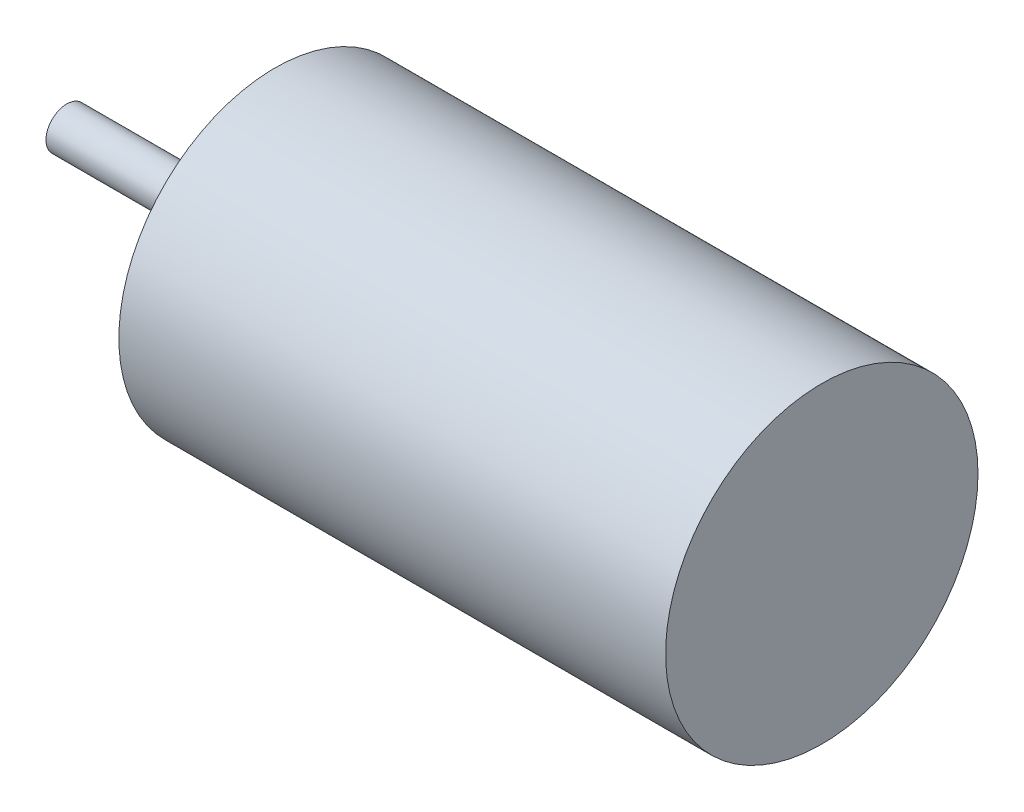
ISO-10303-21;
HEADER;
FILE_DESCRIPTION(('STEP AP214'),'2;1');
FILE_NAME('part.step','',(''),(''),'','','');
FILE_SCHEMA(('AUTOMOTIVE_DESIGN { 1 0 10303 214 1 1 1 1 }'));
ENDSEC;
DATA;
#1=APPLICATION_CONTEXT('core data for automotive mechanical design processes');
#2=APPLICATION_PROTOCOL_DEFINITION('international standard','automotive_design',2000,#1);
#3=PRODUCT_CONTEXT('',#1,'mechanical');
#4=PRODUCT('Part','Part','',(#3));
#5=PRODUCT_RELATED_PRODUCT_CATEGORY('part','',(#4));
#6=PRODUCT_DEFINITION_FORMATION('','',#4);
#7=PRODUCT_DEFINITION_CONTEXT('part definition',#1,'design');
#8=PRODUCT_DEFINITION('design','',#6,#7);
#9=PRODUCT_DEFINITION_SHAPE('','',#8);
#10=(LENGTH_UNIT() NAMED_UNIT(*) SI_UNIT(.MILLI.,.METRE.));
#11=(NAMED_UNIT(*) PLANE_ANGLE_UNIT() SI_UNIT($,.RADIAN.));
#12=(NAMED_UNIT(*) SI_UNIT($,.STERADIAN.) SOLID_ANGLE_UNIT());
#13=UNCERTAINTY_MEASURE_WITH_UNIT(LENGTH_MEASURE(1.E-05),#10,'distance_accuracy_value','');
#14=(GEOMETRIC_REPRESENTATION_CONTEXT(3) GLOBAL_UNCERTAINTY_ASSIGNED_CONTEXT((#13)) GLOBAL_UNIT_ASSIGNED_CONTEXT((#10,
#11,#12)) REPRESENTATION_CONTEXT('',''));
#15=CARTESIAN_POINT('',(0.,0.,0.));
#16=DIRECTION('',(0.,0.,1.));
#17=DIRECTION('',(1.,0.,0.));
#18=AXIS2_PLACEMENT_3D('',#15,#16,#17);
#19=CARTESIAN_POINT('',(0.,0.,-3.));
#20=DIRECTION('',(1.,0.,0.));
#21=DIRECTION('',(0.,0.,-1.));
#22=AXIS2_PLACEMENT_3D('',#19,#20,#21);
#23=PLANE('',#22);
#24=CARTESIAN_POINT('',(0.,0.,0.));
#25=DIRECTION('',(1.,0.,0.));
#26=DIRECTION('',(0.,0.,-1.));
#27=AXIS2_PLACEMENT_3D('',#24,#25,#26);
#28=CIRCLE('',#27,3.);
#29=CARTESIAN_POINT('',(0.,0.,-3.));
#30=VERTEX_POINT('',#29);
#31=EDGE_CURVE('E46',#30,#30,#28,.T.);
#32=ORIENTED_EDGE('',*,*,#31,.T.);
#33=EDGE_LOOP('',(#32));
#34=FACE_BOUND('',#33,.T.);
#35=ADVANCED_FACE('F32',(#34),#23,.T.);
#36=CARTESIAN_POINT('',(-14.5,0.,0.));
#37=DIRECTION('',(-1.,0.,0.));
#38=DIRECTION('',(0.,0.,1.));
#39=AXIS2_PLACEMENT_3D('',#36,#37,#38);
#40=PLANE('',#39);
#41=CARTESIAN_POINT('',(-14.5,0.,0.));
#42=DIRECTION('',(1.,0.,0.));
#43=DIRECTION('',(0.,0.,-1.));
#44=AXIS2_PLACEMENT_3D('',#41,#42,#43);
#45=CIRCLE('',#44,0.4);
#46=CARTESIAN_POINT('',(-14.5,0.,-0.399999999999998));
#47=VERTEX_POINT('',#46);
#48=EDGE_CURVE('E10',#47,#47,#45,.T.);
#49=ORIENTED_EDGE('',*,*,#48,.F.);
#50=EDGE_LOOP('',(#49));
#51=FACE_BOUND('',#50,.T.);
#52=ADVANCED_FACE('F64',(#51),#40,.T.);
#53=CARTESIAN_POINT('',(0.,0.,0.));
#54=DIRECTION('',(1.,0.,0.));
#55=DIRECTION('',(0.,0.,-1.));
#56=AXIS2_PLACEMENT_3D('',#53,#54,#55);
#57=CYLINDRICAL_SURFACE('',#56,0.4);
#58=ORIENTED_EDGE('',*,*,#48,.T.);
#59=EDGE_LOOP('',(#58));
#60=FACE_BOUND('',#59,.T.);
#61=CARTESIAN_POINT('',(-10.5,0.,0.));
#62=DIRECTION('',(1.,0.,0.));
#63=DIRECTION('',(0.,0.,-1.));
#64=AXIS2_PLACEMENT_3D('',#61,#62,#63);
#65=CIRCLE('',#64,0.399999999999999);
#66=CARTESIAN_POINT('',(-10.5,0.,-0.399999999999998));
#67=VERTEX_POINT('',#66);
#68=EDGE_CURVE('E38',#67,#67,#65,.T.);
#69=ORIENTED_EDGE('',*,*,#68,.F.);
#70=EDGE_LOOP('',(#69));
#71=FACE_BOUND('',#70,.T.);
#72=ADVANCED_FACE('F61',(#60,#71),#57,.T.);
#73=CARTESIAN_POINT('',(-10.5,0.,-0.399999999999998));
#74=DIRECTION('',(-1.,0.,0.));
#75=DIRECTION('',(0.,0.,1.));
#76=AXIS2_PLACEMENT_3D('',#73,#74,#75);
#77=PLANE('',#76);
#78=ORIENTED_EDGE('',*,*,#68,.T.);
#79=EDGE_LOOP('',(#78));
#80=FACE_BOUND('',#79,.T.);
#81=CARTESIAN_POINT('',(-10.5,0.,0.));
#82=DIRECTION('',(1.,0.,0.));
#83=DIRECTION('',(0.,0.,-1.));
#84=AXIS2_PLACEMENT_3D('',#81,#82,#83);
#85=CIRCLE('',#84,3.);
#86=CARTESIAN_POINT('',(-10.5,0.,-3.));
#87=VERTEX_POINT('',#86);
#88=EDGE_CURVE('E42',#87,#87,#85,.T.);
#89=ORIENTED_EDGE('',*,*,#88,.F.);
#90=EDGE_LOOP('',(#89));
#91=FACE_BOUND('',#90,.T.);
#92=ADVANCED_FACE('F55',(#80,#91),#77,.T.);
#93=CARTESIAN_POINT('',(0.,0.,0.));
#94=DIRECTION('',(1.,0.,0.));
#95=DIRECTION('',(0.,0.,-1.));
#96=AXIS2_PLACEMENT_3D('',#93,#94,#95);
#97=CYLINDRICAL_SURFACE('',#96,3.);
#98=ORIENTED_EDGE('',*,*,#88,.T.);
#99=EDGE_LOOP('',(#98));
#100=FACE_BOUND('',#99,.T.);
#101=ORIENTED_EDGE('',*,*,#31,.F.);
#102=EDGE_LOOP('',(#101));
#103=FACE_BOUND('',#102,.T.);
#104=ADVANCED_FACE('F53',(#100,#103),#97,.T.);
#105=CLOSED_SHELL('',(#35,#52,#72,#92,#104));
#106=MANIFOLD_SOLID_BREP('B2',#105);
#107=ADVANCED_BREP_SHAPE_REPRESENTATION('',(#18,#106),#14);
#108=SHAPE_DEFINITION_REPRESENTATION(#9,#107);
ENDSEC;
END-ISO-10303-21;
